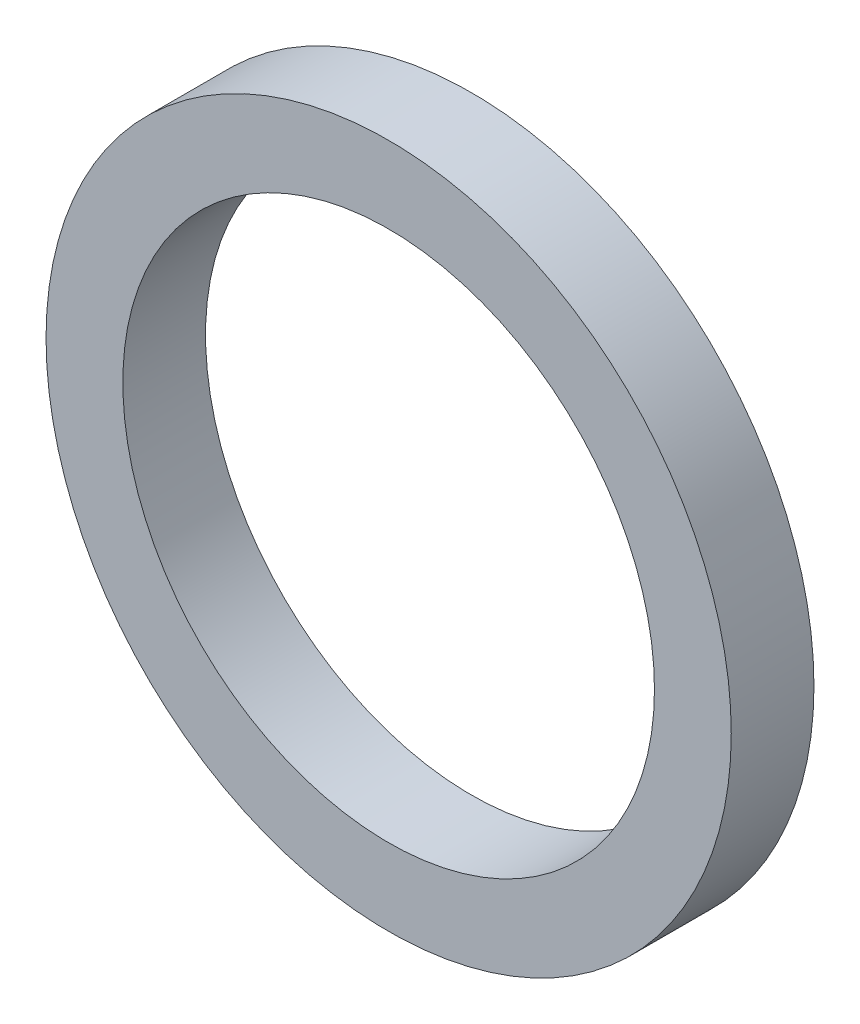
ISO-10303-21;
HEADER;
FILE_DESCRIPTION(('STEP AP214'),'2;1');
FILE_NAME('part.step','',(''),(''),'','','');
FILE_SCHEMA(('AUTOMOTIVE_DESIGN { 1 0 10303 214 1 1 1 1 }'));
ENDSEC;
DATA;
#1=APPLICATION_CONTEXT('core data for automotive mechanical design processes');
#2=APPLICATION_PROTOCOL_DEFINITION('international standard','automotive_design',2000,#1);
#3=PRODUCT_CONTEXT('',#1,'mechanical');
#4=PRODUCT('Part','Part','',(#3));
#5=PRODUCT_RELATED_PRODUCT_CATEGORY('part','',(#4));
#6=PRODUCT_DEFINITION_FORMATION('','',#4);
#7=PRODUCT_DEFINITION_CONTEXT('part definition',#1,'design');
#8=PRODUCT_DEFINITION('design','',#6,#7);
#9=PRODUCT_DEFINITION_SHAPE('','',#8);
#10=(LENGTH_UNIT() NAMED_UNIT(*) SI_UNIT(.MILLI.,.METRE.));
#11=(NAMED_UNIT(*) PLANE_ANGLE_UNIT() SI_UNIT($,.RADIAN.));
#12=(NAMED_UNIT(*) SI_UNIT($,.STERADIAN.) SOLID_ANGLE_UNIT());
#13=UNCERTAINTY_MEASURE_WITH_UNIT(LENGTH_MEASURE(1.E-05),#10,'distance_accuracy_value','');
#14=(GEOMETRIC_REPRESENTATION_CONTEXT(3) GLOBAL_UNCERTAINTY_ASSIGNED_CONTEXT((#13)) GLOBAL_UNIT_ASSIGNED_CONTEXT((#10,
#11,#12)) REPRESENTATION_CONTEXT('',''));
#15=CARTESIAN_POINT('',(0.,0.,0.));
#16=DIRECTION('',(0.,0.,1.));
#17=DIRECTION('',(1.,0.,0.));
#18=AXIS2_PLACEMENT_3D('',#15,#16,#17);
#19=CARTESIAN_POINT('',(0.,0.,7.));
#20=DIRECTION('',(0.,0.,1.));
#21=DIRECTION('',(1.,0.,0.));
#22=AXIS2_PLACEMENT_3D('',#19,#20,#21);
#23=PLANE('',#22);
#24=CARTESIAN_POINT('',(0.,0.,7.));
#25=DIRECTION('',(0.,0.,1.));
#26=DIRECTION('',(1.,0.,0.));
#27=AXIS2_PLACEMENT_3D('',#24,#25,#26);
#28=CIRCLE('',#27,29.);
#29=CARTESIAN_POINT('',(29.,0.,7.));
#30=VERTEX_POINT('',#29);
#31=EDGE_CURVE('E10',#30,#30,#28,.T.);
#32=ORIENTED_EDGE('',*,*,#31,.T.);
#33=EDGE_LOOP('',(#32));
#34=FACE_BOUND('',#33,.T.);
#35=CARTESIAN_POINT('',(0.,0.,7.));
#36=DIRECTION('',(0.,0.,1.));
#37=DIRECTION('',(1.,0.,0.));
#38=AXIS2_PLACEMENT_3D('',#35,#36,#37);
#39=CIRCLE('',#38,22.5);
#40=CARTESIAN_POINT('',(22.5,0.,7.));
#41=VERTEX_POINT('',#40);
#42=EDGE_CURVE('E52',#41,#41,#39,.T.);
#43=ORIENTED_EDGE('',*,*,#42,.F.);
#44=EDGE_LOOP('',(#43));
#45=FACE_BOUND('',#44,.T.);
#46=ADVANCED_FACE('F41',(#34,#45),#23,.T.);
#47=CARTESIAN_POINT('',(0.,0.,0.));
#48=DIRECTION('',(0.,0.,1.));
#49=DIRECTION('',(1.,0.,0.));
#50=AXIS2_PLACEMENT_3D('',#47,#48,#49);
#51=PLANE('',#50);
#52=CARTESIAN_POINT('',(0.,0.,0.));
#53=DIRECTION('',(0.,0.,1.));
#54=DIRECTION('',(1.,0.,0.));
#55=AXIS2_PLACEMENT_3D('',#52,#53,#54);
#56=CIRCLE('',#55,29.);
#57=CARTESIAN_POINT('',(29.,0.,0.));
#58=VERTEX_POINT('',#57);
#59=EDGE_CURVE('E45',#58,#58,#56,.T.);
#60=ORIENTED_EDGE('',*,*,#59,.F.);
#61=EDGE_LOOP('',(#60));
#62=FACE_BOUND('',#61,.T.);
#63=CARTESIAN_POINT('',(0.,0.,0.));
#64=DIRECTION('',(0.,0.,1.));
#65=DIRECTION('',(1.,0.,0.));
#66=AXIS2_PLACEMENT_3D('',#63,#64,#65);
#67=CIRCLE('',#66,22.5);
#68=CARTESIAN_POINT('',(22.5,0.,0.));
#69=VERTEX_POINT('',#68);
#70=EDGE_CURVE('E54',#69,#69,#67,.T.);
#71=ORIENTED_EDGE('',*,*,#70,.T.);
#72=EDGE_LOOP('',(#71));
#73=FACE_BOUND('',#72,.T.);
#74=ADVANCED_FACE('F64',(#62,#73),#51,.F.);
#75=CARTESIAN_POINT('',(0.,0.,7.));
#76=DIRECTION('',(0.,0.,-1.));
#77=DIRECTION('',(-1.,0.,0.));
#78=AXIS2_PLACEMENT_3D('',#75,#76,#77);
#79=CYLINDRICAL_SURFACE('',#78,29.);
#80=ORIENTED_EDGE('',*,*,#31,.F.);
#81=EDGE_LOOP('',(#80));
#82=FACE_BOUND('',#81,.T.);
#83=ORIENTED_EDGE('',*,*,#59,.T.);
#84=EDGE_LOOP('',(#83));
#85=FACE_BOUND('',#84,.T.);
#86=ADVANCED_FACE('F43',(#82,#85),#79,.T.);
#87=CARTESIAN_POINT('',(0.,0.,7.));
#88=DIRECTION('',(0.,0.,-1.));
#89=DIRECTION('',(-1.,0.,0.));
#90=AXIS2_PLACEMENT_3D('',#87,#88,#89);
#91=CYLINDRICAL_SURFACE('',#90,22.5);
#92=ORIENTED_EDGE('',*,*,#42,.T.);
#93=EDGE_LOOP('',(#92));
#94=FACE_BOUND('',#93,.T.);
#95=ORIENTED_EDGE('',*,*,#70,.F.);
#96=EDGE_LOOP('',(#95));
#97=FACE_BOUND('',#96,.T.);
#98=ADVANCED_FACE('F60',(#94,#97),#91,.F.);
#99=CLOSED_SHELL('',(#46,#74,#86,#98));
#100=MANIFOLD_SOLID_BREP('B2',#99);
#101=ADVANCED_BREP_SHAPE_REPRESENTATION('',(#18,#100),#14);
#102=SHAPE_DEFINITION_REPRESENTATION(#9,#101);
ENDSEC;
END-ISO-10303-21;
